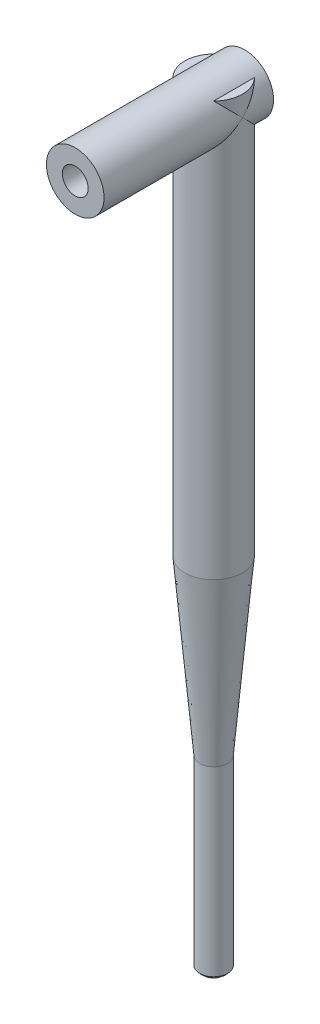
ISO-10303-21;
HEADER;
FILE_DESCRIPTION(('STEP AP214'),'2;1');
FILE_NAME('part.step','',(''),(''),'','','');
FILE_SCHEMA(('AUTOMOTIVE_DESIGN { 1 0 10303 214 1 1 1 1 }'));
ENDSEC;
DATA;
#1=APPLICATION_CONTEXT('core data for automotive mechanical design processes');
#2=APPLICATION_PROTOCOL_DEFINITION('international standard','automotive_design',2000,#1);
#3=PRODUCT_CONTEXT('',#1,'mechanical');
#4=PRODUCT('Part','Part','',(#3));
#5=PRODUCT_RELATED_PRODUCT_CATEGORY('part','',(#4));
#6=PRODUCT_DEFINITION_FORMATION('','',#4);
#7=PRODUCT_DEFINITION_CONTEXT('part definition',#1,'design');
#8=PRODUCT_DEFINITION('design','',#6,#7);
#9=PRODUCT_DEFINITION_SHAPE('','',#8);
#10=(LENGTH_UNIT() NAMED_UNIT(*) SI_UNIT(.MILLI.,.METRE.));
#11=(NAMED_UNIT(*) PLANE_ANGLE_UNIT() SI_UNIT($,.RADIAN.));
#12=(NAMED_UNIT(*) SI_UNIT($,.STERADIAN.) SOLID_ANGLE_UNIT());
#13=UNCERTAINTY_MEASURE_WITH_UNIT(LENGTH_MEASURE(1.E-05),#10,'distance_accuracy_value','');
#14=(GEOMETRIC_REPRESENTATION_CONTEXT(3) GLOBAL_UNCERTAINTY_ASSIGNED_CONTEXT((#13)) GLOBAL_UNIT_ASSIGNED_CONTEXT((#10,
#11,#12)) REPRESENTATION_CONTEXT('',''));
#15=CARTESIAN_POINT('',(0.,0.,0.));
#16=DIRECTION('',(0.,0.,1.));
#17=DIRECTION('',(1.,0.,0.));
#18=AXIS2_PLACEMENT_3D('',#15,#16,#17);
#19=CARTESIAN_POINT('',(0.,4.6,0.));
#20=DIRECTION('',(0.,1.,0.));
#21=DIRECTION('',(0.,0.,1.));
#22=AXIS2_PLACEMENT_3D('',#19,#20,#21);
#23=CYLINDRICAL_SURFACE('',#22,6.5);
#24=CARTESIAN_POINT('',(0.,0.,0.));
#25=DIRECTION('',(0.,0.707106781186547,0.707106781186547));
#26=DIRECTION('',(0.,0.707106781186548,-0.707106781186547));
#27=AXIS2_PLACEMENT_3D('',#24,#25,#26);
#28=ELLIPSE('',#27,9.19238815542511,6.5);
#29=CARTESIAN_POINT('',(-6.5,0.,0.));
#30=VERTEX_POINT('',#29);
#31=CARTESIAN_POINT('',(6.5,0.,0.));
#32=VERTEX_POINT('',#31);
#33=EDGE_CURVE('E73',#30,#32,#28,.T.);
#34=ORIENTED_EDGE('',*,*,#33,.F.);
#35=CARTESIAN_POINT('',(0.,0.,0.));
#36=DIRECTION('',(0.,0.707106781186548,-0.707106781186547));
#37=DIRECTION('',(0.,0.707106781186547,0.707106781186547));
#38=AXIS2_PLACEMENT_3D('',#35,#36,#37);
#39=ELLIPSE('',#38,9.19238815542511,6.5);
#40=EDGE_CURVE('E76',#32,#30,#39,.T.);
#41=ORIENTED_EDGE('',*,*,#40,.F.);
#42=EDGE_LOOP('',(#34,#41));
#43=FACE_BOUND('',#42,.T.);
#44=CARTESIAN_POINT('',(0.,-88.9,0.));
#45=DIRECTION('',(0.,1.,0.));
#46=DIRECTION('',(0.,0.,1.));
#47=AXIS2_PLACEMENT_3D('',#44,#45,#46);
#48=CIRCLE('',#47,6.5);
#49=CARTESIAN_POINT('',(0.,-88.9,6.49999999999999));
#50=VERTEX_POINT('',#49);
#51=EDGE_CURVE('E92',#50,#50,#48,.T.);
#52=ORIENTED_EDGE('',*,*,#51,.T.);
#53=EDGE_LOOP('',(#52));
#54=FACE_BOUND('',#53,.T.);
#55=ADVANCED_FACE('F36',(#43,#54),#23,.T.);
#56=CARTESIAN_POINT('',(0.,-88.9,0.));
#57=DIRECTION('',(0.,1.,0.));
#58=DIRECTION('',(0.,0.,1.));
#59=AXIS2_PLACEMENT_3D('',#56,#57,#58);
#60=CONICAL_SURFACE('',#59,6.5,0.0861326234037269);
#61=CARTESIAN_POINT('',(0.,-127.813093167168,0.));
#62=DIRECTION('',(0.,1.,0.));
#63=DIRECTION('',(0.,0.,1.));
#64=AXIS2_PLACEMENT_3D('',#61,#62,#63);
#65=CIRCLE('',#64,3.14);
#66=CARTESIAN_POINT('',(0.,-127.813093167168,3.13999999999998));
#67=VERTEX_POINT('',#66);
#68=EDGE_CURVE('E95',#67,#67,#65,.T.);
#69=ORIENTED_EDGE('',*,*,#68,.T.);
#70=EDGE_LOOP('',(#69));
#71=FACE_BOUND('',#70,.T.);
#72=ORIENTED_EDGE('',*,*,#51,.F.);
#73=EDGE_LOOP('',(#72));
#74=FACE_BOUND('',#73,.T.);
#75=ADVANCED_FACE('F145',(#71,#74),#60,.T.);
#76=CARTESIAN_POINT('',(0.,4.6,0.));
#77=DIRECTION('',(0.,1.,0.));
#78=DIRECTION('',(0.,0.,1.));
#79=AXIS2_PLACEMENT_3D('',#76,#77,#78);
#80=CYLINDRICAL_SURFACE('',#79,3.14);
#81=CARTESIAN_POINT('',(0.,-168.813093167168,0.));
#82=DIRECTION('',(0.,1.,0.));
#83=DIRECTION('',(0.,0.,1.));
#84=AXIS2_PLACEMENT_3D('',#81,#82,#83);
#85=CIRCLE('',#84,3.14);
#86=CARTESIAN_POINT('',(0.,-168.813093167168,3.13999999999998));
#87=VERTEX_POINT('',#86);
#88=EDGE_CURVE('E98',#87,#87,#85,.T.);
#89=ORIENTED_EDGE('',*,*,#88,.T.);
#90=EDGE_LOOP('',(#89));
#91=FACE_BOUND('',#90,.T.);
#92=ORIENTED_EDGE('',*,*,#68,.F.);
#93=EDGE_LOOP('',(#92));
#94=FACE_BOUND('',#93,.T.);
#95=ADVANCED_FACE('F141',(#91,#94),#80,.T.);
#96=CARTESIAN_POINT('',(0.,-166.5,0.));
#97=DIRECTION('',(0.,1.,0.));
#98=DIRECTION('',(0.,0.,1.));
#99=AXIS2_PLACEMENT_3D('',#96,#97,#98);
#100=SPHERICAL_SURFACE('',#99,3.90000000000002);
#101=ORIENTED_EDGE('',*,*,#88,.F.);
#102=EDGE_LOOP('',(#101));
#103=FACE_BOUND('',#102,.T.);
#104=ADVANCED_FACE('F133',(#103),#100,.T.);
#105=CARTESIAN_POINT('',(0.,0.,-7.));
#106=DIRECTION('',(0.,0.,1.));
#107=DIRECTION('',(1.,0.,0.));
#108=AXIS2_PLACEMENT_3D('',#105,#106,#107);
#109=CYLINDRICAL_SURFACE('',#108,6.5);
#110=CARTESIAN_POINT('',(0.,0.,0.));
#111=DIRECTION('',(0.,0.707106781186548,-0.707106781186547));
#112=DIRECTION('',(0.,0.707106781186547,0.707106781186547));
#113=AXIS2_PLACEMENT_3D('',#110,#111,#112);
#114=ELLIPSE('',#113,9.19238815542511,6.5);
#115=CARTESIAN_POINT('',(4.59238500128201,4.59999999999999,4.59999999999999));
#116=VERTEX_POINT('',#115);
#117=EDGE_CURVE('E45',#32,#116,#114,.F.);
#118=ORIENTED_EDGE('',*,*,#117,.T.);
#119=DIRECTION('',(0.,0.,1.));
#120=VECTOR('',#119,1.);
#121=CARTESIAN_POINT('',(4.59238500128201,4.6,-7.));
#122=LINE('',#121,#120);
#123=CARTESIAN_POINT('',(4.59238500128201,4.59999999999999,-4.6));
#124=VERTEX_POINT('',#123);
#125=EDGE_CURVE('E101',#116,#124,#122,.F.);
#126=ORIENTED_EDGE('',*,*,#125,.T.);
#127=CARTESIAN_POINT('',(0.,0.,0.));
#128=DIRECTION('',(0.,0.707106781186547,0.707106781186547));
#129=DIRECTION('',(0.,0.707106781186548,-0.707106781186547));
#130=AXIS2_PLACEMENT_3D('',#127,#128,#129);
#131=ELLIPSE('',#130,9.19238815542511,6.5);
#132=EDGE_CURVE('E11',#124,#32,#131,.F.);
#133=ORIENTED_EDGE('',*,*,#132,.T.);
#134=ORIENTED_EDGE('',*,*,#40,.T.);
#135=CARTESIAN_POINT('',(-4.59238500128201,4.59999999999999,-4.6));
#136=VERTEX_POINT('',#135);
#137=EDGE_CURVE('E40',#30,#136,#131,.F.);
#138=ORIENTED_EDGE('',*,*,#137,.T.);
#139=DIRECTION('',(0.,0.,1.));
#140=VECTOR('',#139,1.);
#141=CARTESIAN_POINT('',(-4.59238500128201,4.6,-7.));
#142=LINE('',#141,#140);
#143=CARTESIAN_POINT('',(-4.59238500128201,4.59999999999999,4.59999999999999));
#144=VERTEX_POINT('',#143);
#145=EDGE_CURVE('E84',#136,#144,#142,.T.);
#146=ORIENTED_EDGE('',*,*,#145,.T.);
#147=EDGE_CURVE('E59',#144,#30,#114,.F.);
#148=ORIENTED_EDGE('',*,*,#147,.T.);
#149=ORIENTED_EDGE('',*,*,#33,.T.);
#150=EDGE_LOOP('',(#118,#126,#133,#134,#138,#146,#148,#149));
#151=FACE_BOUND('',#150,.T.);
#152=CARTESIAN_POINT('',(0.,0.,-7.));
#153=DIRECTION('',(0.,0.,1.));
#154=DIRECTION('',(1.,0.,0.));
#155=AXIS2_PLACEMENT_3D('',#152,#153,#154);
#156=CIRCLE('',#155,6.5);
#157=CARTESIAN_POINT('',(6.5,0.,-7.));
#158=VERTEX_POINT('',#157);
#159=EDGE_CURVE('E104',#158,#158,#156,.T.);
#160=ORIENTED_EDGE('',*,*,#159,.T.);
#161=EDGE_LOOP('',(#160));
#162=FACE_BOUND('',#161,.T.);
#163=CARTESIAN_POINT('',(0.,0.,31.22));
#164=DIRECTION('',(0.,0.,1.));
#165=DIRECTION('',(1.,0.,0.));
#166=AXIS2_PLACEMENT_3D('',#163,#164,#165);
#167=CIRCLE('',#166,6.5);
#168=CARTESIAN_POINT('',(6.5,0.,31.22));
#169=VERTEX_POINT('',#168);
#170=EDGE_CURVE('E107',#169,#169,#167,.T.);
#171=ORIENTED_EDGE('',*,*,#170,.F.);
#172=EDGE_LOOP('',(#171));
#173=FACE_BOUND('',#172,.T.);
#174=ADVANCED_FACE('F82',(#151,#162,#173),#109,.T.);
#175=CARTESIAN_POINT('',(0.,0.,-7.));
#176=DIRECTION('',(0.,0.,1.));
#177=DIRECTION('',(1.,0.,0.));
#178=AXIS2_PLACEMENT_3D('',#175,#176,#177);
#179=PLANE('',#178);
#180=ORIENTED_EDGE('',*,*,#159,.F.);
#181=EDGE_LOOP('',(#180));
#182=FACE_BOUND('',#181,.T.);
#183=ADVANCED_FACE('F128',(#182),#179,.F.);
#184=CARTESIAN_POINT('',(0.,0.,31.22));
#185=DIRECTION('',(0.,0.,1.));
#186=DIRECTION('',(1.,0.,0.));
#187=AXIS2_PLACEMENT_3D('',#184,#185,#186);
#188=PLANE('',#187);
#189=CARTESIAN_POINT('',(0.,0.,31.22));
#190=DIRECTION('',(0.,0.,1.));
#191=DIRECTION('',(1.,0.,0.));
#192=AXIS2_PLACEMENT_3D('',#189,#190,#191);
#193=CIRCLE('',#192,2.91890671364462);
#194=CARTESIAN_POINT('',(2.91890671364462,0.,31.22));
#195=VERTEX_POINT('',#194);
#196=EDGE_CURVE('E111',#195,#195,#193,.T.);
#197=ORIENTED_EDGE('',*,*,#196,.F.);
#198=EDGE_LOOP('',(#197));
#199=FACE_BOUND('',#198,.T.);
#200=ORIENTED_EDGE('',*,*,#170,.T.);
#201=EDGE_LOOP('',(#200));
#202=FACE_BOUND('',#201,.T.);
#203=ADVANCED_FACE('F125',(#199,#202),#188,.T.);
#204=ORIENTED_EDGE('',*,*,#137,.F.);
#205=ORIENTED_EDGE('',*,*,#147,.F.);
#206=CARTESIAN_POINT('',(0.,4.59999999999999,0.));
#207=DIRECTION('',(0.,1.,0.));
#208=DIRECTION('',(0.,0.,1.));
#209=AXIS2_PLACEMENT_3D('',#206,#207,#208);
#210=CIRCLE('',#209,6.49999999999999);
#211=EDGE_CURVE('E80',#136,#144,#210,.T.);
#212=ORIENTED_EDGE('',*,*,#211,.F.);
#213=EDGE_LOOP('',(#204,#205,#212));
#214=FACE_BOUND('',#213,.T.);
#215=ADVANCED_FACE('F79',(#214),#23,.T.);
#216=CARTESIAN_POINT('',(0.,4.6,6.49999999999999));
#217=DIRECTION('',(0.,1.,0.));
#218=DIRECTION('',(0.,0.,1.));
#219=AXIS2_PLACEMENT_3D('',#216,#217,#218);
#220=PLANE('',#219);
#221=ORIENTED_EDGE('',*,*,#145,.F.);
#222=ORIENTED_EDGE('',*,*,#211,.T.);
#223=EDGE_LOOP('',(#221,#222));
#224=FACE_BOUND('',#223,.T.);
#225=ADVANCED_FACE('F153',(#224),#220,.T.);
#226=ORIENTED_EDGE('',*,*,#132,.F.);
#227=EDGE_CURVE('E85',#116,#124,#210,.T.);
#228=ORIENTED_EDGE('',*,*,#227,.F.);
#229=ORIENTED_EDGE('',*,*,#117,.F.);
#230=EDGE_LOOP('',(#226,#228,#229));
#231=FACE_BOUND('',#230,.T.);
#232=ADVANCED_FACE('F146',(#231),#23,.T.);
#233=ORIENTED_EDGE('',*,*,#125,.F.);
#234=ORIENTED_EDGE('',*,*,#227,.T.);
#235=EDGE_LOOP('',(#233,#234));
#236=FACE_BOUND('',#235,.T.);
#237=ADVANCED_FACE('F38',(#236),#220,.T.);
#238=CARTESIAN_POINT('',(0.,0.,22.86));
#239=DIRECTION('',(0.,0.,1.));
#240=DIRECTION('',(1.,0.,0.));
#241=AXIS2_PLACEMENT_3D('',#238,#239,#240);
#242=CYLINDRICAL_SURFACE('',#241,2.91890671364462);
#243=CARTESIAN_POINT('',(0.,0.,22.86));
#244=DIRECTION('',(0.,0.,1.));
#245=DIRECTION('',(1.,0.,0.));
#246=AXIS2_PLACEMENT_3D('',#243,#244,#245);
#247=CIRCLE('',#246,2.91890671364462);
#248=CARTESIAN_POINT('',(2.91890671364462,0.,22.86));
#249=VERTEX_POINT('',#248);
#250=EDGE_CURVE('E110',#249,#249,#247,.T.);
#251=ORIENTED_EDGE('',*,*,#250,.F.);
#252=EDGE_LOOP('',(#251));
#253=FACE_BOUND('',#252,.T.);
#254=ORIENTED_EDGE('',*,*,#196,.T.);
#255=EDGE_LOOP('',(#254));
#256=FACE_BOUND('',#255,.T.);
#257=ADVANCED_FACE('F119',(#253,#256),#242,.F.);
#258=CARTESIAN_POINT('',(0.,0.,22.86));
#259=DIRECTION('',(0.,0.,1.));
#260=DIRECTION('',(1.,0.,0.));
#261=AXIS2_PLACEMENT_3D('',#258,#259,#260);
#262=PLANE('',#261);
#263=ORIENTED_EDGE('',*,*,#250,.T.);
#264=EDGE_LOOP('',(#263));
#265=FACE_BOUND('',#264,.T.);
#266=ADVANCED_FACE('F117',(#265),#262,.T.);
#267=CLOSED_SHELL('',(#55,#75,#95,#104,#174,#183,#203,#215,#225,#232,#237,#257,#266));
#268=MANIFOLD_SOLID_BREP('B2',#267);
#269=ADVANCED_BREP_SHAPE_REPRESENTATION('',(#18,#268),#14);
#270=SHAPE_DEFINITION_REPRESENTATION(#9,#269);
ENDSEC;
END-ISO-10303-21;
